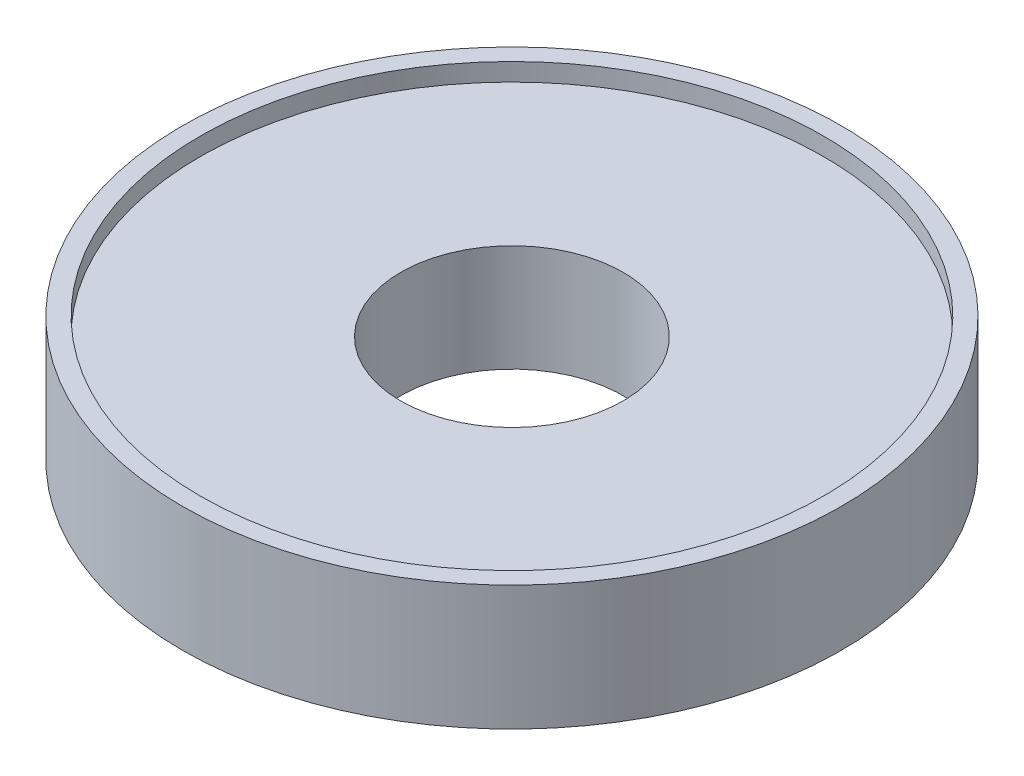
ISO-10303-21;
HEADER;
FILE_DESCRIPTION(('STEP AP214'),'2;1');
FILE_NAME('part.step','',(''),(''),'','','');
FILE_SCHEMA(('AUTOMOTIVE_DESIGN { 1 0 10303 214 1 1 1 1 }'));
ENDSEC;
DATA;
#1=APPLICATION_CONTEXT('core data for automotive mechanical design processes');
#2=APPLICATION_PROTOCOL_DEFINITION('international standard','automotive_design',2000,#1);
#3=PRODUCT_CONTEXT('',#1,'mechanical');
#4=PRODUCT('Part','Part','',(#3));
#5=PRODUCT_RELATED_PRODUCT_CATEGORY('part','',(#4));
#6=PRODUCT_DEFINITION_FORMATION('','',#4);
#7=PRODUCT_DEFINITION_CONTEXT('part definition',#1,'design');
#8=PRODUCT_DEFINITION('design','',#6,#7);
#9=PRODUCT_DEFINITION_SHAPE('','',#8);
#10=(LENGTH_UNIT() NAMED_UNIT(*) SI_UNIT(.MILLI.,.METRE.));
#11=(NAMED_UNIT(*) PLANE_ANGLE_UNIT() SI_UNIT($,.RADIAN.));
#12=(NAMED_UNIT(*) SI_UNIT($,.STERADIAN.) SOLID_ANGLE_UNIT());
#13=UNCERTAINTY_MEASURE_WITH_UNIT(LENGTH_MEASURE(1.E-05),#10,'distance_accuracy_value','');
#14=(GEOMETRIC_REPRESENTATION_CONTEXT(3) GLOBAL_UNCERTAINTY_ASSIGNED_CONTEXT((#13)) GLOBAL_UNIT_ASSIGNED_CONTEXT((#10,
#11,#12)) REPRESENTATION_CONTEXT('',''));
#15=CARTESIAN_POINT('',(0.,0.,0.));
#16=DIRECTION('',(0.,0.,1.));
#17=DIRECTION('',(1.,0.,0.));
#18=AXIS2_PLACEMENT_3D('',#15,#16,#17);
#19=CARTESIAN_POINT('',(0.,6.,0.));
#20=DIRECTION('',(0.,-1.,0.));
#21=DIRECTION('',(0.,0.,-1.));
#22=AXIS2_PLACEMENT_3D('',#19,#20,#21);
#23=CYLINDRICAL_SURFACE('',#22,18.5);
#24=CARTESIAN_POINT('',(0.,0.,0.));
#25=DIRECTION('',(0.,1.,0.));
#26=DIRECTION('',(0.,0.,1.));
#27=AXIS2_PLACEMENT_3D('',#24,#25,#26);
#28=CIRCLE('',#27,18.5);
#29=CARTESIAN_POINT('',(0.,0.,18.5));
#30=VERTEX_POINT('',#29);
#31=EDGE_CURVE('E41',#30,#30,#28,.T.);
#32=ORIENTED_EDGE('',*,*,#31,.T.);
#33=EDGE_LOOP('',(#32));
#34=FACE_BOUND('',#33,.T.);
#35=CARTESIAN_POINT('',(0.,7.,0.));
#36=DIRECTION('',(0.,1.,0.));
#37=DIRECTION('',(0.,0.,1.));
#38=AXIS2_PLACEMENT_3D('',#35,#36,#37);
#39=CIRCLE('',#38,18.5);
#40=CARTESIAN_POINT('',(0.,7.,18.5));
#41=VERTEX_POINT('',#40);
#42=EDGE_CURVE('E45',#41,#41,#39,.T.);
#43=ORIENTED_EDGE('',*,*,#42,.F.);
#44=EDGE_LOOP('',(#43));
#45=FACE_BOUND('',#44,.T.);
#46=ADVANCED_FACE('F35',(#34,#45),#23,.T.);
#47=CARTESIAN_POINT('',(0.,0.,0.));
#48=DIRECTION('',(0.,1.,0.));
#49=DIRECTION('',(0.,0.,1.));
#50=AXIS2_PLACEMENT_3D('',#47,#48,#49);
#51=PLANE('',#50);
#52=CARTESIAN_POINT('',(-10.6066017177982,0.,-10.6066017177982));
#53=DIRECTION('',(0.,-1.,0.));
#54=DIRECTION('',(0.,0.,-1.));
#55=AXIS2_PLACEMENT_3D('',#52,#53,#54);
#56=CIRCLE('',#55,1.5);
#57=CARTESIAN_POINT('',(-10.6066017177982,0.,-12.1066017177982));
#58=VERTEX_POINT('',#57);
#59=EDGE_CURVE('E70',#58,#58,#56,.T.);
#60=ORIENTED_EDGE('',*,*,#59,.F.);
#61=EDGE_LOOP('',(#60));
#62=FACE_BOUND('',#61,.T.);
#63=CARTESIAN_POINT('',(10.6066017177982,0.,-10.6066017177982));
#64=DIRECTION('',(0.,-1.,0.));
#65=DIRECTION('',(0.,0.,-1.));
#66=AXIS2_PLACEMENT_3D('',#63,#64,#65);
#67=CIRCLE('',#66,1.5);
#68=CARTESIAN_POINT('',(10.6066017177982,0.,-12.1066017177982));
#69=VERTEX_POINT('',#68);
#70=EDGE_CURVE('E76',#69,#69,#67,.T.);
#71=ORIENTED_EDGE('',*,*,#70,.F.);
#72=EDGE_LOOP('',(#71));
#73=FACE_BOUND('',#72,.T.);
#74=CARTESIAN_POINT('',(10.6066017177982,0.,10.6066017177982));
#75=DIRECTION('',(0.,-1.,0.));
#76=DIRECTION('',(0.,0.,-1.));
#77=AXIS2_PLACEMENT_3D('',#74,#75,#76);
#78=CIRCLE('',#77,1.5);
#79=CARTESIAN_POINT('',(10.6066017177982,0.,9.10660171779821));
#80=VERTEX_POINT('',#79);
#81=EDGE_CURVE('E64',#80,#80,#78,.T.);
#82=ORIENTED_EDGE('',*,*,#81,.F.);
#83=EDGE_LOOP('',(#82));
#84=FACE_BOUND('',#83,.T.);
#85=CARTESIAN_POINT('',(-10.6066017177982,0.,10.6066017177982));
#86=DIRECTION('',(0.,-1.,0.));
#87=DIRECTION('',(0.,0.,-1.));
#88=AXIS2_PLACEMENT_3D('',#85,#86,#87);
#89=CIRCLE('',#88,1.5);
#90=CARTESIAN_POINT('',(-10.6066017177982,0.,9.10660171779821));
#91=VERTEX_POINT('',#90);
#92=EDGE_CURVE('E61',#91,#91,#89,.T.);
#93=ORIENTED_EDGE('',*,*,#92,.F.);
#94=EDGE_LOOP('',(#93));
#95=FACE_BOUND('',#94,.T.);
#96=CARTESIAN_POINT('',(0.,0.,0.));
#97=DIRECTION('',(0.,1.,0.));
#98=DIRECTION('',(0.,0.,1.));
#99=AXIS2_PLACEMENT_3D('',#96,#97,#98);
#100=CIRCLE('',#99,6.25);
#101=CARTESIAN_POINT('',(0.,0.,6.25));
#102=VERTEX_POINT('',#101);
#103=EDGE_CURVE('E54',#102,#102,#100,.T.);
#104=ORIENTED_EDGE('',*,*,#103,.T.);
#105=EDGE_LOOP('',(#104));
#106=FACE_BOUND('',#105,.T.);
#107=ORIENTED_EDGE('',*,*,#31,.F.);
#108=EDGE_LOOP('',(#107));
#109=FACE_BOUND('',#108,.T.);
#110=ADVANCED_FACE('F87',(#62,#73,#84,#95,#106,#109),#51,.F.);
#111=CARTESIAN_POINT('',(0.,7.,0.));
#112=DIRECTION('',(0.,1.,0.));
#113=DIRECTION('',(0.,0.,1.));
#114=AXIS2_PLACEMENT_3D('',#111,#112,#113);
#115=PLANE('',#114);
#116=ORIENTED_EDGE('',*,*,#42,.T.);
#117=EDGE_LOOP('',(#116));
#118=FACE_BOUND('',#117,.T.);
#119=CARTESIAN_POINT('',(0.,7.,0.));
#120=DIRECTION('',(0.,1.,0.));
#121=DIRECTION('',(0.,0.,1.));
#122=AXIS2_PLACEMENT_3D('',#119,#120,#121);
#123=CIRCLE('',#122,17.5);
#124=CARTESIAN_POINT('',(0.,7.,17.5));
#125=VERTEX_POINT('',#124);
#126=EDGE_CURVE('E49',#125,#125,#123,.T.);
#127=ORIENTED_EDGE('',*,*,#126,.F.);
#128=EDGE_LOOP('',(#127));
#129=FACE_BOUND('',#128,.T.);
#130=ADVANCED_FACE('F90',(#118,#129),#115,.T.);
#131=CARTESIAN_POINT('',(0.,7.,0.));
#132=DIRECTION('',(0.,-1.,0.));
#133=DIRECTION('',(0.,0.,-1.));
#134=AXIS2_PLACEMENT_3D('',#131,#132,#133);
#135=CYLINDRICAL_SURFACE('',#134,17.5);
#136=ORIENTED_EDGE('',*,*,#126,.T.);
#137=EDGE_LOOP('',(#136));
#138=FACE_BOUND('',#137,.T.);
#139=CARTESIAN_POINT('',(0.,6.,0.));
#140=DIRECTION('',(0.,1.,0.));
#141=DIRECTION('',(0.,0.,1.));
#142=AXIS2_PLACEMENT_3D('',#139,#140,#141);
#143=CIRCLE('',#142,17.5);
#144=CARTESIAN_POINT('',(0.,6.,17.5));
#145=VERTEX_POINT('',#144);
#146=EDGE_CURVE('E10',#145,#145,#143,.F.);
#147=ORIENTED_EDGE('',*,*,#146,.T.);
#148=EDGE_LOOP('',(#147));
#149=FACE_BOUND('',#148,.T.);
#150=ADVANCED_FACE('F107',(#138,#149),#135,.F.);
#151=CARTESIAN_POINT('',(0.,6.,0.));
#152=DIRECTION('',(0.,1.,0.));
#153=DIRECTION('',(0.,0.,1.));
#154=AXIS2_PLACEMENT_3D('',#151,#152,#153);
#155=PLANE('',#154);
#156=CARTESIAN_POINT('',(0.,6.,0.));
#157=DIRECTION('',(0.,1.,0.));
#158=DIRECTION('',(0.,0.,1.));
#159=AXIS2_PLACEMENT_3D('',#156,#157,#158);
#160=CIRCLE('',#159,6.24999999999999);
#161=CARTESIAN_POINT('',(0.,6.,6.24999999999999));
#162=VERTEX_POINT('',#161);
#163=EDGE_CURVE('E57',#162,#162,#160,.T.);
#164=ORIENTED_EDGE('',*,*,#163,.F.);
#165=EDGE_LOOP('',(#164));
#166=FACE_BOUND('',#165,.T.);
#167=ORIENTED_EDGE('',*,*,#146,.F.);
#168=EDGE_LOOP('',(#167));
#169=FACE_BOUND('',#168,.T.);
#170=ADVANCED_FACE('F101',(#166,#169),#155,.T.);
#171=CARTESIAN_POINT('',(0.,6.,0.));
#172=DIRECTION('',(0.,1.,0.));
#173=DIRECTION('',(0.,0.,1.));
#174=AXIS2_PLACEMENT_3D('',#171,#172,#173);
#175=CYLINDRICAL_SURFACE('',#174,6.24999999999999);
#176=ORIENTED_EDGE('',*,*,#103,.F.);
#177=EDGE_LOOP('',(#176));
#178=FACE_BOUND('',#177,.T.);
#179=ORIENTED_EDGE('',*,*,#163,.T.);
#180=EDGE_LOOP('',(#179));
#181=FACE_BOUND('',#180,.T.);
#182=ADVANCED_FACE('F97',(#178,#181),#175,.F.);
#183=CARTESIAN_POINT('',(-10.6066017177982,4.,10.6066017177982));
#184=DIRECTION('',(0.,-1.,0.));
#185=DIRECTION('',(0.,0.,-1.));
#186=AXIS2_PLACEMENT_3D('',#183,#184,#185);
#187=CYLINDRICAL_SURFACE('',#186,1.5);
#188=CARTESIAN_POINT('',(-10.6066017177982,4.,10.6066017177982));
#189=DIRECTION('',(0.,-1.,0.));
#190=DIRECTION('',(0.,0.,-1.));
#191=AXIS2_PLACEMENT_3D('',#188,#189,#190);
#192=CIRCLE('',#191,1.5);
#193=CARTESIAN_POINT('',(-10.6066017177982,4.,9.10660171779821));
#194=VERTEX_POINT('',#193);
#195=EDGE_CURVE('E60',#194,#194,#192,.T.);
#196=ORIENTED_EDGE('',*,*,#195,.F.);
#197=EDGE_LOOP('',(#196));
#198=FACE_BOUND('',#197,.T.);
#199=ORIENTED_EDGE('',*,*,#92,.T.);
#200=EDGE_LOOP('',(#199));
#201=FACE_BOUND('',#200,.T.);
#202=ADVANCED_FACE('F100',(#198,#201),#187,.F.);
#203=CARTESIAN_POINT('',(-10.6066017177982,4.,10.6066017177982));
#204=DIRECTION('',(0.,-1.,0.));
#205=DIRECTION('',(0.,0.,-1.));
#206=AXIS2_PLACEMENT_3D('',#203,#204,#205);
#207=PLANE('',#206);
#208=ORIENTED_EDGE('',*,*,#195,.T.);
#209=EDGE_LOOP('',(#208));
#210=FACE_BOUND('',#209,.T.);
#211=ADVANCED_FACE('F129',(#210),#207,.T.);
#212=CARTESIAN_POINT('',(10.6066017177982,4.,10.6066017177982));
#213=DIRECTION('',(0.,-1.,0.));
#214=DIRECTION('',(0.,0.,-1.));
#215=AXIS2_PLACEMENT_3D('',#212,#213,#214);
#216=CYLINDRICAL_SURFACE('',#215,1.5);
#217=CARTESIAN_POINT('',(10.6066017177982,4.,10.6066017177982));
#218=DIRECTION('',(0.,-1.,0.));
#219=DIRECTION('',(0.,0.,-1.));
#220=AXIS2_PLACEMENT_3D('',#217,#218,#219);
#221=CIRCLE('',#220,1.5);
#222=CARTESIAN_POINT('',(10.6066017177982,4.,9.10660171779821));
#223=VERTEX_POINT('',#222);
#224=EDGE_CURVE('E79',#223,#223,#221,.T.);
#225=ORIENTED_EDGE('',*,*,#224,.F.);
#226=EDGE_LOOP('',(#225));
#227=FACE_BOUND('',#226,.T.);
#228=ORIENTED_EDGE('',*,*,#81,.T.);
#229=EDGE_LOOP('',(#228));
#230=FACE_BOUND('',#229,.T.);
#231=ADVANCED_FACE('F85',(#227,#230),#216,.F.);
#232=CARTESIAN_POINT('',(10.6066017177982,4.,10.6066017177982));
#233=DIRECTION('',(0.,-1.,0.));
#234=DIRECTION('',(0.,0.,-1.));
#235=AXIS2_PLACEMENT_3D('',#232,#233,#234);
#236=PLANE('',#235);
#237=ORIENTED_EDGE('',*,*,#224,.T.);
#238=EDGE_LOOP('',(#237));
#239=FACE_BOUND('',#238,.T.);
#240=ADVANCED_FACE('F149',(#239),#236,.T.);
#241=CARTESIAN_POINT('',(10.6066017177982,4.,-10.6066017177982));
#242=DIRECTION('',(0.,-1.,0.));
#243=DIRECTION('',(0.,0.,-1.));
#244=AXIS2_PLACEMENT_3D('',#241,#242,#243);
#245=CYLINDRICAL_SURFACE('',#244,1.5);
#246=CARTESIAN_POINT('',(10.6066017177982,4.,-10.6066017177982));
#247=DIRECTION('',(0.,-1.,0.));
#248=DIRECTION('',(0.,0.,-1.));
#249=AXIS2_PLACEMENT_3D('',#246,#247,#248);
#250=CIRCLE('',#249,1.5);
#251=CARTESIAN_POINT('',(10.6066017177982,4.,-12.1066017177982));
#252=VERTEX_POINT('',#251);
#253=EDGE_CURVE('E73',#252,#252,#250,.T.);
#254=ORIENTED_EDGE('',*,*,#253,.F.);
#255=EDGE_LOOP('',(#254));
#256=FACE_BOUND('',#255,.T.);
#257=ORIENTED_EDGE('',*,*,#70,.T.);
#258=EDGE_LOOP('',(#257));
#259=FACE_BOUND('',#258,.T.);
#260=ADVANCED_FACE('F145',(#256,#259),#245,.F.);
#261=CARTESIAN_POINT('',(10.6066017177982,4.,-10.6066017177982));
#262=DIRECTION('',(0.,-1.,0.));
#263=DIRECTION('',(0.,0.,-1.));
#264=AXIS2_PLACEMENT_3D('',#261,#262,#263);
#265=PLANE('',#264);
#266=ORIENTED_EDGE('',*,*,#253,.T.);
#267=EDGE_LOOP('',(#266));
#268=FACE_BOUND('',#267,.T.);
#269=ADVANCED_FACE('F141',(#268),#265,.T.);
#270=CARTESIAN_POINT('',(-10.6066017177982,4.,-10.6066017177982));
#271=DIRECTION('',(0.,-1.,0.));
#272=DIRECTION('',(0.,0.,-1.));
#273=AXIS2_PLACEMENT_3D('',#270,#271,#272);
#274=CYLINDRICAL_SURFACE('',#273,1.5);
#275=CARTESIAN_POINT('',(-10.6066017177982,4.,-10.6066017177982));
#276=DIRECTION('',(0.,-1.,0.));
#277=DIRECTION('',(0.,0.,-1.));
#278=AXIS2_PLACEMENT_3D('',#275,#276,#277);
#279=CIRCLE('',#278,1.5);
#280=CARTESIAN_POINT('',(-10.6066017177982,4.,-12.1066017177982));
#281=VERTEX_POINT('',#280);
#282=EDGE_CURVE('E67',#281,#281,#279,.T.);
#283=ORIENTED_EDGE('',*,*,#282,.F.);
#284=EDGE_LOOP('',(#283));
#285=FACE_BOUND('',#284,.T.);
#286=ORIENTED_EDGE('',*,*,#59,.T.);
#287=EDGE_LOOP('',(#286));
#288=FACE_BOUND('',#287,.T.);
#289=ADVANCED_FACE('F137',(#285,#288),#274,.F.);
#290=CARTESIAN_POINT('',(-10.6066017177982,4.,-10.6066017177982));
#291=DIRECTION('',(0.,-1.,0.));
#292=DIRECTION('',(0.,0.,-1.));
#293=AXIS2_PLACEMENT_3D('',#290,#291,#292);
#294=PLANE('',#293);
#295=ORIENTED_EDGE('',*,*,#282,.T.);
#296=EDGE_LOOP('',(#295));
#297=FACE_BOUND('',#296,.T.);
#298=ADVANCED_FACE('F134',(#297),#294,.T.);
#299=CLOSED_SHELL('',(#46,#110,#130,#150,#170,#182,#202,#211,#231,#240,#260,#269,#289,#298));
#300=MANIFOLD_SOLID_BREP('B2',#299);
#301=ADVANCED_BREP_SHAPE_REPRESENTATION('',(#18,#300),#14);
#302=SHAPE_DEFINITION_REPRESENTATION(#9,#301);
ENDSEC;
END-ISO-10303-21;
